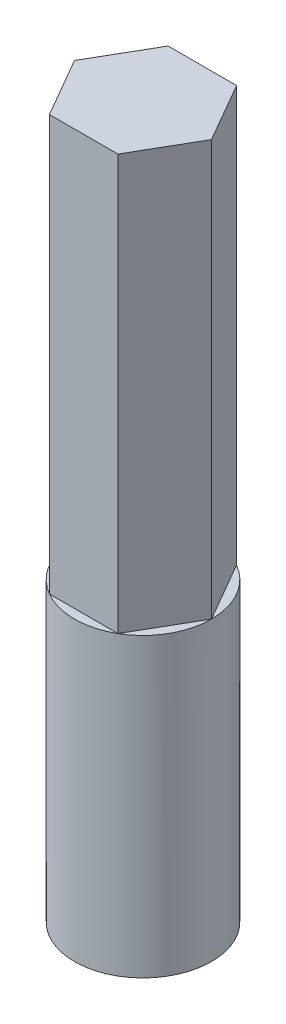
ISO-10303-21;
HEADER;
FILE_DESCRIPTION(('STEP AP214'),'2;1');
FILE_NAME('part.step','',(''),(''),'','','');
FILE_SCHEMA(('AUTOMOTIVE_DESIGN { 1 0 10303 214 1 1 1 1 }'));
ENDSEC;
DATA;
#1=APPLICATION_CONTEXT('core data for automotive mechanical design processes');
#2=APPLICATION_PROTOCOL_DEFINITION('international standard','automotive_design',2000,#1);
#3=PRODUCT_CONTEXT('',#1,'mechanical');
#4=PRODUCT('Part','Part','',(#3));
#5=PRODUCT_RELATED_PRODUCT_CATEGORY('part','',(#4));
#6=PRODUCT_DEFINITION_FORMATION('','',#4);
#7=PRODUCT_DEFINITION_CONTEXT('part definition',#1,'design');
#8=PRODUCT_DEFINITION('design','',#6,#7);
#9=PRODUCT_DEFINITION_SHAPE('','',#8);
#10=(LENGTH_UNIT() NAMED_UNIT(*) SI_UNIT(.MILLI.,.METRE.));
#11=(NAMED_UNIT(*) PLANE_ANGLE_UNIT() SI_UNIT($,.RADIAN.));
#12=(NAMED_UNIT(*) SI_UNIT($,.STERADIAN.) SOLID_ANGLE_UNIT());
#13=UNCERTAINTY_MEASURE_WITH_UNIT(LENGTH_MEASURE(1.E-05),#10,'distance_accuracy_value','');
#14=(GEOMETRIC_REPRESENTATION_CONTEXT(3) GLOBAL_UNCERTAINTY_ASSIGNED_CONTEXT((#13)) GLOBAL_UNIT_ASSIGNED_CONTEXT((#10,
#11,#12)) REPRESENTATION_CONTEXT('',''));
#15=CARTESIAN_POINT('',(0.,0.,0.));
#16=DIRECTION('',(0.,0.,1.));
#17=DIRECTION('',(1.,0.,0.));
#18=AXIS2_PLACEMENT_3D('',#15,#16,#17);
#19=CARTESIAN_POINT('',(3.66617420935412,44.45,6.35000000000001));
#20=DIRECTION('',(-0.866025403784439,0.,-0.5));
#21=DIRECTION('',(-0.5,0.,0.866025403784439));
#22=AXIS2_PLACEMENT_3D('',#19,#20,#21);
#23=PLANE('',#22);
#24=DIRECTION('',(0.5,0.,-0.866025403784439));
#25=VECTOR('',#24,1.);
#26=CARTESIAN_POINT('',(3.66617420935412,0.,6.35000000000001));
#27=LINE('',#26,#25);
#28=CARTESIAN_POINT('',(3.66617420935412,0.,6.35000000000001));
#29=VERTEX_POINT('',#28);
#30=CARTESIAN_POINT('',(7.33234841870825,0.,0.));
#31=VERTEX_POINT('',#30);
#32=EDGE_CURVE('E92',#29,#31,#27,.T.);
#33=ORIENTED_EDGE('',*,*,#32,.T.);
#34=DIRECTION('',(0.,-1.,0.));
#35=VECTOR('',#34,1.);
#36=CARTESIAN_POINT('',(7.33234841870825,44.45,0.));
#37=LINE('',#36,#35);
#38=CARTESIAN_POINT('',(7.33234841870825,44.45,0.));
#39=VERTEX_POINT('',#38);
#40=EDGE_CURVE('E11',#39,#31,#37,.T.);
#41=ORIENTED_EDGE('',*,*,#40,.F.);
#42=DIRECTION('',(0.5,0.,-0.866025403784439));
#43=VECTOR('',#42,1.);
#44=CARTESIAN_POINT('',(3.66617420935412,44.45,6.35000000000001));
#45=LINE('',#44,#43);
#46=CARTESIAN_POINT('',(3.66617420935412,44.45,6.35000000000001));
#47=VERTEX_POINT('',#46);
#48=EDGE_CURVE('E134',#47,#39,#45,.T.);
#49=ORIENTED_EDGE('',*,*,#48,.F.);
#50=DIRECTION('',(0.,-1.,0.));
#51=VECTOR('',#50,1.);
#52=CARTESIAN_POINT('',(3.66617420935412,44.45,6.35000000000001));
#53=LINE('',#52,#51);
#54=EDGE_CURVE('E117',#47,#29,#53,.T.);
#55=ORIENTED_EDGE('',*,*,#54,.T.);
#56=EDGE_LOOP('',(#33,#41,#49,#55));
#57=FACE_BOUND('',#56,.T.);
#58=ADVANCED_FACE('F34',(#57),#23,.F.);
#59=CARTESIAN_POINT('',(7.33234841870825,44.45,0.));
#60=DIRECTION('',(-0.866025403784439,0.,0.5));
#61=DIRECTION('',(0.5,0.,0.866025403784439));
#62=AXIS2_PLACEMENT_3D('',#59,#60,#61);
#63=PLANE('',#62);
#64=DIRECTION('',(-0.5,0.,-0.866025403784439));
#65=VECTOR('',#64,1.);
#66=CARTESIAN_POINT('',(7.33234841870825,0.,0.));
#67=LINE('',#66,#65);
#68=CARTESIAN_POINT('',(3.66617420935412,0.,-6.35000000000002));
#69=VERTEX_POINT('',#68);
#70=EDGE_CURVE('E82',#31,#69,#67,.T.);
#71=ORIENTED_EDGE('',*,*,#70,.T.);
#72=DIRECTION('',(0.,-1.,0.));
#73=VECTOR('',#72,1.);
#74=CARTESIAN_POINT('',(3.66617420935412,44.45,-6.35000000000002));
#75=LINE('',#74,#73);
#76=CARTESIAN_POINT('',(3.66617420935412,44.45,-6.35000000000002));
#77=VERTEX_POINT('',#76);
#78=EDGE_CURVE('E42',#77,#69,#75,.T.);
#79=ORIENTED_EDGE('',*,*,#78,.F.);
#80=DIRECTION('',(-0.5,0.,-0.866025403784439));
#81=VECTOR('',#80,1.);
#82=CARTESIAN_POINT('',(7.33234841870825,44.45,0.));
#83=LINE('',#82,#81);
#84=EDGE_CURVE('E113',#39,#77,#83,.T.);
#85=ORIENTED_EDGE('',*,*,#84,.F.);
#86=ORIENTED_EDGE('',*,*,#40,.T.);
#87=EDGE_LOOP('',(#71,#79,#85,#86));
#88=FACE_BOUND('',#87,.T.);
#89=ADVANCED_FACE('F112',(#88),#63,.F.);
#90=CARTESIAN_POINT('',(3.66617420935412,44.45,-6.35000000000002));
#91=DIRECTION('',(0.,0.,1.));
#92=DIRECTION('',(1.,0.,0.));
#93=AXIS2_PLACEMENT_3D('',#90,#91,#92);
#94=PLANE('',#93);
#95=DIRECTION('',(-1.,0.,0.));
#96=VECTOR('',#95,1.);
#97=CARTESIAN_POINT('',(3.66617420935412,0.,-6.35000000000002));
#98=LINE('',#97,#96);
#99=CARTESIAN_POINT('',(-3.6661742093541,0.,-6.35000000000002));
#100=VERTEX_POINT('',#99);
#101=EDGE_CURVE('E91',#69,#100,#98,.T.);
#102=ORIENTED_EDGE('',*,*,#101,.T.);
#103=DIRECTION('',(0.,-1.,0.));
#104=VECTOR('',#103,1.);
#105=CARTESIAN_POINT('',(-3.66617420935413,44.45,-6.35000000000002));
#106=LINE('',#105,#104);
#107=CARTESIAN_POINT('',(-3.66617420935413,44.45,-6.35000000000002));
#108=VERTEX_POINT('',#107);
#109=EDGE_CURVE('E142',#108,#100,#106,.T.);
#110=ORIENTED_EDGE('',*,*,#109,.F.);
#111=DIRECTION('',(-1.,0.,0.));
#112=VECTOR('',#111,1.);
#113=CARTESIAN_POINT('',(3.66617420935412,44.45,-6.35000000000002));
#114=LINE('',#113,#112);
#115=EDGE_CURVE('E148',#77,#108,#114,.T.);
#116=ORIENTED_EDGE('',*,*,#115,.F.);
#117=ORIENTED_EDGE('',*,*,#78,.T.);
#118=EDGE_LOOP('',(#102,#110,#116,#117));
#119=FACE_BOUND('',#118,.T.);
#120=ADVANCED_FACE('F146',(#119),#94,.F.);
#121=CARTESIAN_POINT('',(-3.66617420935413,44.45,-6.35000000000002));
#122=DIRECTION('',(0.866025403784439,0.,0.5));
#123=DIRECTION('',(0.5,0.,-0.866025403784439));
#124=AXIS2_PLACEMENT_3D('',#121,#122,#123);
#125=PLANE('',#124);
#126=DIRECTION('',(-0.5,0.,0.866025403784439));
#127=VECTOR('',#126,1.);
#128=CARTESIAN_POINT('',(-3.66617420935413,0.,-6.35000000000002));
#129=LINE('',#128,#127);
#130=CARTESIAN_POINT('',(-7.33234841870825,0.,0.));
#131=VERTEX_POINT('',#130);
#132=EDGE_CURVE('E126',#100,#131,#129,.T.);
#133=ORIENTED_EDGE('',*,*,#132,.T.);
#134=DIRECTION('',(0.,-1.,0.));
#135=VECTOR('',#134,1.);
#136=CARTESIAN_POINT('',(-7.33234841870826,44.45,0.));
#137=LINE('',#136,#135);
#138=CARTESIAN_POINT('',(-7.33234841870826,44.45,0.));
#139=VERTEX_POINT('',#138);
#140=EDGE_CURVE('E139',#139,#131,#137,.T.);
#141=ORIENTED_EDGE('',*,*,#140,.F.);
#142=DIRECTION('',(-0.5,0.,0.866025403784439));
#143=VECTOR('',#142,1.);
#144=CARTESIAN_POINT('',(-3.66617420935413,44.45,-6.35000000000002));
#145=LINE('',#144,#143);
#146=EDGE_CURVE('E150',#108,#139,#145,.T.);
#147=ORIENTED_EDGE('',*,*,#146,.F.);
#148=ORIENTED_EDGE('',*,*,#109,.T.);
#149=EDGE_LOOP('',(#133,#141,#147,#148));
#150=FACE_BOUND('',#149,.T.);
#151=ADVANCED_FACE('F193',(#150),#125,.F.);
#152=CARTESIAN_POINT('',(-7.33234841870826,44.45,0.));
#153=DIRECTION('',(0.866025403784439,0.,-0.5));
#154=DIRECTION('',(-0.5,0.,-0.866025403784439));
#155=AXIS2_PLACEMENT_3D('',#152,#153,#154);
#156=PLANE('',#155);
#157=DIRECTION('',(0.5,0.,0.866025403784439));
#158=VECTOR('',#157,1.);
#159=CARTESIAN_POINT('',(-7.33234841870826,0.,0.));
#160=LINE('',#159,#158);
#161=CARTESIAN_POINT('',(-3.66617420935414,0.,6.34999999999999));
#162=VERTEX_POINT('',#161);
#163=EDGE_CURVE('E129',#131,#162,#160,.T.);
#164=ORIENTED_EDGE('',*,*,#163,.T.);
#165=DIRECTION('',(0.,-1.,0.));
#166=VECTOR('',#165,1.);
#167=CARTESIAN_POINT('',(-3.66617420935413,44.45,6.35000000000001));
#168=LINE('',#167,#166);
#169=CARTESIAN_POINT('',(-3.66617420935413,44.45,6.35000000000001));
#170=VERTEX_POINT('',#169);
#171=EDGE_CURVE('E136',#170,#162,#168,.T.);
#172=ORIENTED_EDGE('',*,*,#171,.F.);
#173=DIRECTION('',(0.5,0.,0.866025403784439));
#174=VECTOR('',#173,1.);
#175=CARTESIAN_POINT('',(-7.33234841870826,44.45,0.));
#176=LINE('',#175,#174);
#177=EDGE_CURVE('E152',#139,#170,#176,.T.);
#178=ORIENTED_EDGE('',*,*,#177,.F.);
#179=ORIENTED_EDGE('',*,*,#140,.T.);
#180=EDGE_LOOP('',(#164,#172,#178,#179));
#181=FACE_BOUND('',#180,.T.);
#182=ADVANCED_FACE('F161',(#181),#156,.F.);
#183=CARTESIAN_POINT('',(-3.66617420935413,44.45,6.35000000000001));
#184=DIRECTION('',(0.,0.,-1.));
#185=DIRECTION('',(-1.,0.,0.));
#186=AXIS2_PLACEMENT_3D('',#183,#184,#185);
#187=PLANE('',#186);
#188=DIRECTION('',(1.,0.,0.));
#189=VECTOR('',#188,1.);
#190=CARTESIAN_POINT('',(-3.66617420935413,0.,6.35000000000001));
#191=LINE('',#190,#189);
#192=EDGE_CURVE('E132',#162,#29,#191,.T.);
#193=ORIENTED_EDGE('',*,*,#192,.T.);
#194=ORIENTED_EDGE('',*,*,#54,.F.);
#195=DIRECTION('',(1.,0.,0.));
#196=VECTOR('',#195,1.);
#197=CARTESIAN_POINT('',(-3.66617420935413,44.45,6.35000000000001));
#198=LINE('',#197,#196);
#199=EDGE_CURVE('E49',#170,#47,#198,.T.);
#200=ORIENTED_EDGE('',*,*,#199,.F.);
#201=ORIENTED_EDGE('',*,*,#171,.T.);
#202=EDGE_LOOP('',(#193,#194,#200,#201));
#203=FACE_BOUND('',#202,.T.);
#204=ADVANCED_FACE('F163',(#203),#187,.F.);
#205=CARTESIAN_POINT('',(0.,44.45,0.));
#206=DIRECTION('',(0.,1.,0.));
#207=DIRECTION('',(0.,0.,1.));
#208=AXIS2_PLACEMENT_3D('',#205,#206,#207);
#209=PLANE('',#208);
#210=ORIENTED_EDGE('',*,*,#48,.T.);
#211=ORIENTED_EDGE('',*,*,#84,.T.);
#212=ORIENTED_EDGE('',*,*,#115,.T.);
#213=ORIENTED_EDGE('',*,*,#146,.T.);
#214=ORIENTED_EDGE('',*,*,#177,.T.);
#215=ORIENTED_EDGE('',*,*,#199,.T.);
#216=EDGE_LOOP('',(#210,#211,#212,#213,#214,#215));
#217=FACE_BOUND('',#216,.T.);
#218=ADVANCED_FACE('F158',(#217),#209,.T.);
#219=CARTESIAN_POINT('',(0.,0.,0.));
#220=DIRECTION('',(0.,-1.,0.));
#221=DIRECTION('',(0.,0.,-1.));
#222=AXIS2_PLACEMENT_3D('',#219,#220,#221);
#223=PLANE('',#222);
#224=ORIENTED_EDGE('',*,*,#32,.F.);
#225=CARTESIAN_POINT('',(0.,0.,0.));
#226=DIRECTION('',(0.,-1.,0.));
#227=DIRECTION('',(0.,0.,-1.));
#228=AXIS2_PLACEMENT_3D('',#225,#226,#227);
#229=CIRCLE('',#228,7.33234841870825);
#230=EDGE_CURVE('E96',#31,#29,#229,.T.);
#231=ORIENTED_EDGE('',*,*,#230,.F.);
#232=EDGE_LOOP('',(#224,#231));
#233=FACE_BOUND('',#232,.T.);
#234=ADVANCED_FACE('F97',(#233),#223,.F.);
#235=ORIENTED_EDGE('',*,*,#192,.F.);
#236=EDGE_CURVE('E103',#29,#162,#229,.T.);
#237=ORIENTED_EDGE('',*,*,#236,.F.);
#238=EDGE_LOOP('',(#235,#237));
#239=FACE_BOUND('',#238,.T.);
#240=ADVANCED_FACE('F166',(#239),#223,.F.);
#241=ORIENTED_EDGE('',*,*,#163,.F.);
#242=EDGE_CURVE('E169',#162,#131,#229,.T.);
#243=ORIENTED_EDGE('',*,*,#242,.F.);
#244=EDGE_LOOP('',(#241,#243));
#245=FACE_BOUND('',#244,.T.);
#246=ADVANCED_FACE('F170',(#245),#223,.F.);
#247=ORIENTED_EDGE('',*,*,#132,.F.);
#248=EDGE_CURVE('E172',#131,#100,#229,.T.);
#249=ORIENTED_EDGE('',*,*,#248,.F.);
#250=EDGE_LOOP('',(#247,#249));
#251=FACE_BOUND('',#250,.T.);
#252=ADVANCED_FACE('F174',(#251),#223,.F.);
#253=ORIENTED_EDGE('',*,*,#101,.F.);
#254=EDGE_CURVE('E108',#100,#69,#229,.T.);
#255=ORIENTED_EDGE('',*,*,#254,.F.);
#256=EDGE_LOOP('',(#253,#255));
#257=FACE_BOUND('',#256,.T.);
#258=ADVANCED_FACE('F177',(#257),#223,.F.);
#259=ORIENTED_EDGE('',*,*,#70,.F.);
#260=EDGE_CURVE('E86',#69,#31,#229,.T.);
#261=ORIENTED_EDGE('',*,*,#260,.F.);
#262=EDGE_LOOP('',(#259,#261));
#263=FACE_BOUND('',#262,.T.);
#264=ADVANCED_FACE('F84',(#263),#223,.F.);
#265=CARTESIAN_POINT('',(0.,-31.75,0.));
#266=DIRECTION('',(0.,1.,0.));
#267=DIRECTION('',(0.,0.,1.));
#268=AXIS2_PLACEMENT_3D('',#265,#266,#267);
#269=CYLINDRICAL_SURFACE('',#268,7.33234841870825);
#270=CARTESIAN_POINT('',(0.,-31.75,0.));
#271=DIRECTION('',(0.,-1.,0.));
#272=DIRECTION('',(0.,0.,-1.));
#273=AXIS2_PLACEMENT_3D('',#270,#271,#272);
#274=CIRCLE('',#273,7.33234841870825);
#275=CARTESIAN_POINT('',(0.,-31.75,-7.33234841870825));
#276=VERTEX_POINT('',#275);
#277=EDGE_CURVE('E110',#276,#276,#274,.T.);
#278=ORIENTED_EDGE('',*,*,#277,.F.);
#279=EDGE_LOOP('',(#278));
#280=FACE_BOUND('',#279,.T.);
#281=ORIENTED_EDGE('',*,*,#260,.T.);
#282=ORIENTED_EDGE('',*,*,#230,.T.);
#283=ORIENTED_EDGE('',*,*,#236,.T.);
#284=ORIENTED_EDGE('',*,*,#242,.T.);
#285=ORIENTED_EDGE('',*,*,#248,.T.);
#286=ORIENTED_EDGE('',*,*,#254,.T.);
#287=EDGE_LOOP('',(#281,#282,#283,#284,#285,#286));
#288=FACE_BOUND('',#287,.T.);
#289=ADVANCED_FACE('F105',(#280,#288),#269,.T.);
#290=CARTESIAN_POINT('',(0.,-31.75,0.));
#291=DIRECTION('',(0.,-1.,0.));
#292=DIRECTION('',(0.,0.,-1.));
#293=AXIS2_PLACEMENT_3D('',#290,#291,#292);
#294=PLANE('',#293);
#295=ORIENTED_EDGE('',*,*,#277,.T.);
#296=EDGE_LOOP('',(#295));
#297=FACE_BOUND('',#296,.T.);
#298=ADVANCED_FACE('F204',(#297),#294,.T.);
#299=CLOSED_SHELL('',(#58,#89,#120,#151,#182,#204,#218,#234,#240,#246,#252,#258,#264,#289,#298));
#300=MANIFOLD_SOLID_BREP('B2',#299);
#301=ADVANCED_BREP_SHAPE_REPRESENTATION('',(#18,#300),#14);
#302=SHAPE_DEFINITION_REPRESENTATION(#9,#301);
ENDSEC;
END-ISO-10303-21;
